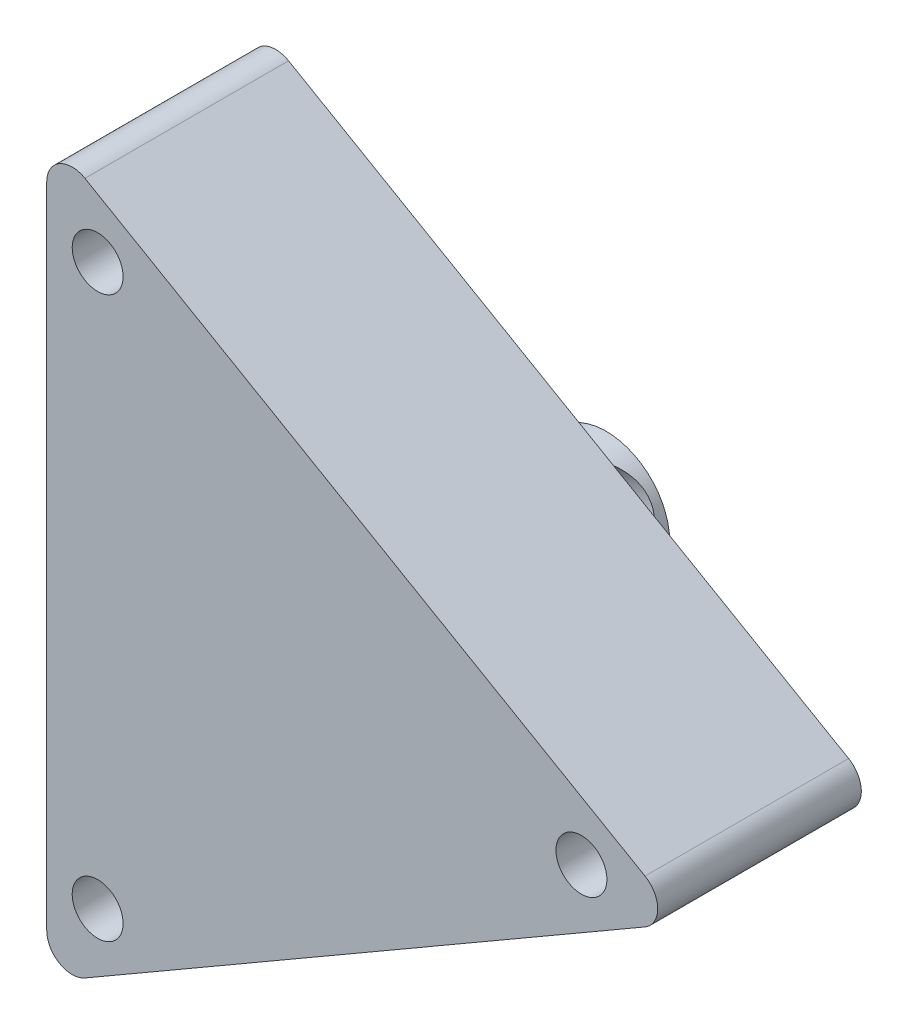
ISO-10303-21;
HEADER;
FILE_DESCRIPTION(('STEP AP214'),'2;1');
FILE_NAME('part.step','',(''),(''),'','','');
FILE_SCHEMA(('AUTOMOTIVE_DESIGN { 1 0 10303 214 1 1 1 1 }'));
ENDSEC;
DATA;
#1=APPLICATION_CONTEXT('core data for automotive mechanical design processes');
#2=APPLICATION_PROTOCOL_DEFINITION('international standard','automotive_design',2000,#1);
#3=PRODUCT_CONTEXT('',#1,'mechanical');
#4=PRODUCT('Part','Part','',(#3));
#5=PRODUCT_RELATED_PRODUCT_CATEGORY('part','',(#4));
#6=PRODUCT_DEFINITION_FORMATION('','',#4);
#7=PRODUCT_DEFINITION_CONTEXT('part definition',#1,'design');
#8=PRODUCT_DEFINITION('design','',#6,#7);
#9=PRODUCT_DEFINITION_SHAPE('','',#8);
#10=(LENGTH_UNIT() NAMED_UNIT(*) SI_UNIT(.MILLI.,.METRE.));
#11=(NAMED_UNIT(*) PLANE_ANGLE_UNIT() SI_UNIT($,.RADIAN.));
#12=(NAMED_UNIT(*) SI_UNIT($,.STERADIAN.) SOLID_ANGLE_UNIT());
#13=UNCERTAINTY_MEASURE_WITH_UNIT(LENGTH_MEASURE(1.E-05),#10,'distance_accuracy_value','');
#14=(GEOMETRIC_REPRESENTATION_CONTEXT(3) GLOBAL_UNCERTAINTY_ASSIGNED_CONTEXT((#13)) GLOBAL_UNIT_ASSIGNED_CONTEXT((#10,
#11,#12)) REPRESENTATION_CONTEXT('',''));
#15=CARTESIAN_POINT('',(0.,0.,0.));
#16=DIRECTION('',(0.,0.,1.));
#17=DIRECTION('',(1.,0.,0.));
#18=AXIS2_PLACEMENT_3D('',#15,#16,#17);
#19=CARTESIAN_POINT('',(-25.1468144044321,25.478473852621,16.));
#20=DIRECTION('',(0.,0.,-1.));
#21=DIRECTION('',(-1.,0.,0.));
#22=AXIS2_PLACEMENT_3D('',#19,#20,#21);
#23=CYLINDRICAL_SURFACE('',#22,2.);
#24=CARTESIAN_POINT('',(-25.1468144044321,25.478473852621,0.));
#25=DIRECTION('',(0.,0.,-1.));
#26=DIRECTION('',(-1.,0.,0.));
#27=AXIS2_PLACEMENT_3D('',#24,#25,#26);
#28=CIRCLE('',#27,2.);
#29=CARTESIAN_POINT('',(-27.1468144044321,25.478473852621,0.));
#30=VERTEX_POINT('',#29);
#31=CARTESIAN_POINT('',(-24.1447418633488,27.2093264235833,0.));
#32=VERTEX_POINT('',#31);
#33=EDGE_CURVE('E125',#30,#32,#28,.T.);
#34=ORIENTED_EDGE('',*,*,#33,.F.);
#35=DIRECTION('',(0.,0.,-1.));
#36=VECTOR('',#35,1.);
#37=CARTESIAN_POINT('',(-27.1468144044321,25.478473852621,16.));
#38=LINE('',#37,#36);
#39=CARTESIAN_POINT('',(-27.1468144044321,25.478473852621,16.));
#40=VERTEX_POINT('',#39);
#41=EDGE_CURVE('E54',#40,#30,#38,.T.);
#42=ORIENTED_EDGE('',*,*,#41,.F.);
#43=CARTESIAN_POINT('',(-25.1468144044321,25.478473852621,16.));
#44=DIRECTION('',(0.,0.,-1.));
#45=DIRECTION('',(-1.,0.,0.));
#46=AXIS2_PLACEMENT_3D('',#43,#44,#45);
#47=CIRCLE('',#46,2.);
#48=CARTESIAN_POINT('',(-24.1447418633488,27.2093264235833,16.));
#49=VERTEX_POINT('',#48);
#50=EDGE_CURVE('E141',#40,#49,#47,.T.);
#51=ORIENTED_EDGE('',*,*,#50,.T.);
#52=DIRECTION('',(0.,0.,-1.));
#53=VECTOR('',#52,1.);
#54=CARTESIAN_POINT('',(-24.1447418633488,27.2093264235833,16.));
#55=LINE('',#54,#53);
#56=EDGE_CURVE('E89',#49,#32,#55,.T.);
#57=ORIENTED_EDGE('',*,*,#56,.T.);
#58=EDGE_LOOP('',(#34,#42,#51,#57));
#59=FACE_BOUND('',#58,.T.);
#60=ADVANCED_FACE('F33',(#59),#23,.T.);
#61=CARTESIAN_POINT('',(-27.1468144044321,-25.478473852621,16.));
#62=DIRECTION('',(-1.,0.,0.));
#63=DIRECTION('',(0.,0.,1.));
#64=AXIS2_PLACEMENT_3D('',#61,#62,#63);
#65=PLANE('',#64);
#66=DIRECTION('',(0.,1.,0.));
#67=VECTOR('',#66,1.);
#68=CARTESIAN_POINT('',(-27.1468144044321,-25.478473852621,0.));
#69=LINE('',#68,#67);
#70=CARTESIAN_POINT('',(-27.1468144044321,-25.478473852621,0.));
#71=VERTEX_POINT('',#70);
#72=EDGE_CURVE('E138',#71,#30,#69,.T.);
#73=ORIENTED_EDGE('',*,*,#72,.F.);
#74=DIRECTION('',(0.,0.,-1.));
#75=VECTOR('',#74,1.);
#76=CARTESIAN_POINT('',(-27.1468144044321,-25.478473852621,16.));
#77=LINE('',#76,#75);
#78=CARTESIAN_POINT('',(-27.1468144044321,-25.478473852621,16.));
#79=VERTEX_POINT('',#78);
#80=EDGE_CURVE('E77',#79,#71,#77,.T.);
#81=ORIENTED_EDGE('',*,*,#80,.F.);
#82=DIRECTION('',(0.,1.,0.));
#83=VECTOR('',#82,1.);
#84=CARTESIAN_POINT('',(-27.1468144044321,-25.478473852621,16.));
#85=LINE('',#84,#83);
#86=EDGE_CURVE('E115',#79,#40,#85,.T.);
#87=ORIENTED_EDGE('',*,*,#86,.T.);
#88=ORIENTED_EDGE('',*,*,#41,.T.);
#89=EDGE_LOOP('',(#73,#81,#87,#88));
#90=FACE_BOUND('',#89,.T.);
#91=ADVANCED_FACE('F186',(#90),#65,.T.);
#92=CARTESIAN_POINT('',(-25.1468144044321,-25.478473852621,16.));
#93=DIRECTION('',(0.,0.,-1.));
#94=DIRECTION('',(-1.,0.,0.));
#95=AXIS2_PLACEMENT_3D('',#92,#93,#94);
#96=CYLINDRICAL_SURFACE('',#95,2.);
#97=CARTESIAN_POINT('',(-25.1468144044321,-25.478473852621,0.));
#98=DIRECTION('',(0.,0.,-1.));
#99=DIRECTION('',(-1.,0.,0.));
#100=AXIS2_PLACEMENT_3D('',#97,#98,#99);
#101=CIRCLE('',#100,2.);
#102=CARTESIAN_POINT('',(-24.1447418633487,-27.2093264235833,0.));
#103=VERTEX_POINT('',#102);
#104=EDGE_CURVE('E102',#103,#71,#101,.T.);
#105=ORIENTED_EDGE('',*,*,#104,.F.);
#106=DIRECTION('',(0.,0.,-1.));
#107=VECTOR('',#106,1.);
#108=CARTESIAN_POINT('',(-24.1447418633487,-27.2093264235833,16.));
#109=LINE('',#108,#107);
#110=CARTESIAN_POINT('',(-24.1447418633487,-27.2093264235833,16.));
#111=VERTEX_POINT('',#110);
#112=EDGE_CURVE('E97',#111,#103,#109,.T.);
#113=ORIENTED_EDGE('',*,*,#112,.F.);
#114=CARTESIAN_POINT('',(-25.1468144044321,-25.478473852621,16.));
#115=DIRECTION('',(0.,0.,-1.));
#116=DIRECTION('',(-1.,0.,0.));
#117=AXIS2_PLACEMENT_3D('',#114,#115,#116);
#118=CIRCLE('',#117,2.);
#119=EDGE_CURVE('E100',#111,#79,#118,.T.);
#120=ORIENTED_EDGE('',*,*,#119,.T.);
#121=ORIENTED_EDGE('',*,*,#80,.T.);
#122=EDGE_LOOP('',(#105,#113,#120,#121));
#123=FACE_BOUND('',#122,.T.);
#124=ADVANCED_FACE('F99',(#123),#96,.T.);
#125=CARTESIAN_POINT('',(19.8635311548149,-1.73085257096226,16.));
#126=DIRECTION('',(0.501036270541704,-0.865426285481126,0.));
#127=DIRECTION('',(0.865426285481126,0.501036270541704,0.));
#128=AXIS2_PLACEMENT_3D('',#125,#126,#127);
#129=PLANE('',#128);
#130=DIRECTION('',(-0.865426285481126,-0.501036270541704,0.));
#131=VECTOR('',#130,1.);
#132=CARTESIAN_POINT('',(19.8635311548149,-1.73085257096226,0.));
#133=LINE('',#132,#131);
#134=CARTESIAN_POINT('',(19.8635311548149,-1.73085257096226,0.));
#135=VERTEX_POINT('',#134);
#136=EDGE_CURVE('E135',#135,#103,#133,.T.);
#137=ORIENTED_EDGE('',*,*,#136,.F.);
#138=DIRECTION('',(0.,0.,-1.));
#139=VECTOR('',#138,1.);
#140=CARTESIAN_POINT('',(19.8635311548149,-1.73085257096226,16.));
#141=LINE('',#140,#139);
#142=CARTESIAN_POINT('',(19.8635311548149,-1.73085257096226,16.));
#143=VERTEX_POINT('',#142);
#144=EDGE_CURVE('E107',#143,#135,#141,.T.);
#145=ORIENTED_EDGE('',*,*,#144,.F.);
#146=DIRECTION('',(-0.865426285481126,-0.501036270541704,0.));
#147=VECTOR('',#146,1.);
#148=CARTESIAN_POINT('',(19.8635311548149,-1.73085257096226,16.));
#149=LINE('',#148,#147);
#150=EDGE_CURVE('E113',#143,#111,#149,.T.);
#151=ORIENTED_EDGE('',*,*,#150,.T.);
#152=ORIENTED_EDGE('',*,*,#112,.T.);
#153=EDGE_LOOP('',(#137,#145,#151,#152));
#154=FACE_BOUND('',#153,.T.);
#155=ADVANCED_FACE('F117',(#154),#129,.T.);
#156=CARTESIAN_POINT('',(18.8614586137315,0.,16.));
#157=DIRECTION('',(0.,0.,-1.));
#158=DIRECTION('',(-1.,0.,0.));
#159=AXIS2_PLACEMENT_3D('',#156,#157,#158);
#160=CYLINDRICAL_SURFACE('',#159,2.00000000000002);
#161=CARTESIAN_POINT('',(18.8614586137315,0.,0.));
#162=DIRECTION('',(0.,0.,-1.));
#163=DIRECTION('',(-1.,0.,0.));
#164=AXIS2_PLACEMENT_3D('',#161,#162,#163);
#165=CIRCLE('',#164,2.00000000000002);
#166=CARTESIAN_POINT('',(19.8635311548149,1.73085257096225,0.));
#167=VERTEX_POINT('',#166);
#168=EDGE_CURVE('E132',#167,#135,#165,.T.);
#169=ORIENTED_EDGE('',*,*,#168,.F.);
#170=DIRECTION('',(0.,0.,-1.));
#171=VECTOR('',#170,1.);
#172=CARTESIAN_POINT('',(19.8635311548149,1.73085257096225,16.));
#173=LINE('',#172,#171);
#174=CARTESIAN_POINT('',(19.8635311548149,1.73085257096225,16.));
#175=VERTEX_POINT('',#174);
#176=EDGE_CURVE('E145',#175,#167,#173,.T.);
#177=ORIENTED_EDGE('',*,*,#176,.F.);
#178=CARTESIAN_POINT('',(18.8614586137315,0.,16.));
#179=DIRECTION('',(0.,0.,-1.));
#180=DIRECTION('',(-1.,0.,0.));
#181=AXIS2_PLACEMENT_3D('',#178,#179,#180);
#182=CIRCLE('',#181,2.00000000000002);
#183=EDGE_CURVE('E118',#175,#143,#182,.T.);
#184=ORIENTED_EDGE('',*,*,#183,.T.);
#185=ORIENTED_EDGE('',*,*,#144,.T.);
#186=EDGE_LOOP('',(#169,#177,#184,#185));
#187=FACE_BOUND('',#186,.T.);
#188=ADVANCED_FACE('F194',(#187),#160,.T.);
#189=CARTESIAN_POINT('',(-24.1447418633488,27.2093264235833,16.));
#190=DIRECTION('',(0.501036270541704,0.865426285481126,0.));
#191=DIRECTION('',(-0.865426285481126,0.501036270541704,0.));
#192=AXIS2_PLACEMENT_3D('',#189,#190,#191);
#193=PLANE('',#192);
#194=DIRECTION('',(0.865426285481126,-0.501036270541704,0.));
#195=VECTOR('',#194,1.);
#196=CARTESIAN_POINT('',(-24.1447418633488,27.2093264235833,0.));
#197=LINE('',#196,#195);
#198=EDGE_CURVE('E128',#32,#167,#197,.T.);
#199=ORIENTED_EDGE('',*,*,#198,.F.);
#200=ORIENTED_EDGE('',*,*,#56,.F.);
#201=DIRECTION('',(0.865426285481126,-0.501036270541704,0.));
#202=VECTOR('',#201,1.);
#203=CARTESIAN_POINT('',(-24.1447418633488,27.2093264235833,16.));
#204=LINE('',#203,#202);
#205=EDGE_CURVE('E120',#49,#175,#204,.T.);
#206=ORIENTED_EDGE('',*,*,#205,.T.);
#207=ORIENTED_EDGE('',*,*,#176,.T.);
#208=EDGE_LOOP('',(#199,#200,#206,#207));
#209=FACE_BOUND('',#208,.T.);
#210=ADVANCED_FACE('F195',(#209),#193,.T.);
#211=CARTESIAN_POINT('',(-25.1468144044321,25.478473852621,16.));
#212=DIRECTION('',(0.,0.,-1.));
#213=DIRECTION('',(-1.,0.,0.));
#214=AXIS2_PLACEMENT_3D('',#211,#212,#213);
#215=PLANE('',#214);
#216=CARTESIAN_POINT('',(-23.1468144044321,-22.0095792841894,16.));
#217=DIRECTION('',(0.,0.,-1.));
#218=DIRECTION('',(-1.,0.,0.));
#219=AXIS2_PLACEMENT_3D('',#216,#217,#218);
#220=CIRCLE('',#219,2.);
#221=CARTESIAN_POINT('',(-25.1468144044321,-22.0095792841894,16.));
#222=VERTEX_POINT('',#221);
#223=EDGE_CURVE('E212',#222,#222,#220,.T.);
#224=ORIENTED_EDGE('',*,*,#223,.T.);
#225=EDGE_LOOP('',(#224));
#226=FACE_BOUND('',#225,.T.);
#227=CARTESIAN_POINT('',(14.8697316318951,0.,16.));
#228=DIRECTION('',(0.,0.,-1.));
#229=DIRECTION('',(-1.,0.,0.));
#230=AXIS2_PLACEMENT_3D('',#227,#228,#229);
#231=CIRCLE('',#230,2.);
#232=CARTESIAN_POINT('',(12.8697316318951,0.,16.));
#233=VERTEX_POINT('',#232);
#234=EDGE_CURVE('E206',#233,#233,#231,.T.);
#235=ORIENTED_EDGE('',*,*,#234,.T.);
#236=EDGE_LOOP('',(#235));
#237=FACE_BOUND('',#236,.T.);
#238=CARTESIAN_POINT('',(-23.1468144044321,22.0095792841894,16.));
#239=DIRECTION('',(0.,0.,-1.));
#240=DIRECTION('',(-1.,0.,0.));
#241=AXIS2_PLACEMENT_3D('',#238,#239,#240);
#242=CIRCLE('',#241,2.);
#243=CARTESIAN_POINT('',(-25.1468144044321,22.0095792841894,16.));
#244=VERTEX_POINT('',#243);
#245=EDGE_CURVE('E200',#244,#244,#242,.T.);
#246=ORIENTED_EDGE('',*,*,#245,.T.);
#247=EDGE_LOOP('',(#246));
#248=FACE_BOUND('',#247,.T.);
#249=ORIENTED_EDGE('',*,*,#50,.F.);
#250=ORIENTED_EDGE('',*,*,#86,.F.);
#251=ORIENTED_EDGE('',*,*,#119,.F.);
#252=ORIENTED_EDGE('',*,*,#150,.F.);
#253=ORIENTED_EDGE('',*,*,#183,.F.);
#254=ORIENTED_EDGE('',*,*,#205,.F.);
#255=EDGE_LOOP('',(#249,#250,#251,#252,#253,#254));
#256=FACE_BOUND('',#255,.T.);
#257=ADVANCED_FACE('F111',(#226,#237,#248,#256),#215,.F.);
#258=CARTESIAN_POINT('',(-25.1468144044321,25.478473852621,0.));
#259=DIRECTION('',(0.,0.,-1.));
#260=DIRECTION('',(-1.,0.,0.));
#261=AXIS2_PLACEMENT_3D('',#258,#259,#260);
#262=PLANE('',#261);
#263=CARTESIAN_POINT('',(-23.1468144044321,-22.0095792841894,0.));
#264=DIRECTION('',(0.,0.,-1.));
#265=DIRECTION('',(-1.,0.,0.));
#266=AXIS2_PLACEMENT_3D('',#263,#264,#265);
#267=CIRCLE('',#266,1.99999999999999);
#268=CARTESIAN_POINT('',(-25.1468144044321,-22.0095792841894,0.));
#269=VERTEX_POINT('',#268);
#270=EDGE_CURVE('E154',#269,#269,#267,.T.);
#271=ORIENTED_EDGE('',*,*,#270,.F.);
#272=EDGE_LOOP('',(#271));
#273=FACE_BOUND('',#272,.T.);
#274=CARTESIAN_POINT('',(14.8697316318951,0.,0.));
#275=DIRECTION('',(0.,0.,-1.));
#276=DIRECTION('',(-1.,0.,0.));
#277=AXIS2_PLACEMENT_3D('',#274,#275,#276);
#278=CIRCLE('',#277,1.99999999999999);
#279=CARTESIAN_POINT('',(12.8697316318951,0.,0.));
#280=VERTEX_POINT('',#279);
#281=EDGE_CURVE('E209',#280,#280,#278,.T.);
#282=ORIENTED_EDGE('',*,*,#281,.F.);
#283=EDGE_LOOP('',(#282));
#284=FACE_BOUND('',#283,.T.);
#285=CARTESIAN_POINT('',(-23.1468144044321,22.0095792841894,0.));
#286=DIRECTION('',(0.,0.,-1.));
#287=DIRECTION('',(-1.,0.,0.));
#288=AXIS2_PLACEMENT_3D('',#285,#286,#287);
#289=CIRCLE('',#288,1.99999999999999);
#290=CARTESIAN_POINT('',(-25.1468144044321,22.0095792841894,0.));
#291=VERTEX_POINT('',#290);
#292=EDGE_CURVE('E203',#291,#291,#289,.T.);
#293=ORIENTED_EDGE('',*,*,#292,.F.);
#294=EDGE_LOOP('',(#293));
#295=FACE_BOUND('',#294,.T.);
#296=CARTESIAN_POINT('',(-9.19345641604796,-0.521526147378951,0.));
#297=DIRECTION('',(0.,0.,-1.));
#298=DIRECTION('',(-1.,0.,0.));
#299=AXIS2_PLACEMENT_3D('',#296,#297,#298);
#300=CIRCLE('',#299,5.);
#301=CARTESIAN_POINT('',(-14.193456416048,-0.521526147378951,0.));
#302=VERTEX_POINT('',#301);
#303=EDGE_CURVE('E46',#302,#302,#300,.T.);
#304=ORIENTED_EDGE('',*,*,#303,.F.);
#305=EDGE_LOOP('',(#304));
#306=FACE_BOUND('',#305,.T.);
#307=ORIENTED_EDGE('',*,*,#33,.T.);
#308=ORIENTED_EDGE('',*,*,#198,.T.);
#309=ORIENTED_EDGE('',*,*,#168,.T.);
#310=ORIENTED_EDGE('',*,*,#136,.T.);
#311=ORIENTED_EDGE('',*,*,#104,.T.);
#312=ORIENTED_EDGE('',*,*,#72,.T.);
#313=EDGE_LOOP('',(#307,#308,#309,#310,#311,#312));
#314=FACE_BOUND('',#313,.T.);
#315=ADVANCED_FACE('F182',(#273,#284,#295,#306,#314),#262,.T.);
#316=CARTESIAN_POINT('',(-9.19345641604796,-0.521526147378951,-10.));
#317=DIRECTION('',(0.,0.,1.));
#318=DIRECTION('',(1.,0.,0.));
#319=AXIS2_PLACEMENT_3D('',#316,#317,#318);
#320=CYLINDRICAL_SURFACE('',#319,5.);
#321=CARTESIAN_POINT('',(-4.19345641604796,-0.521526147378951,-8.24439691200529));
#322=CARTESIAN_POINT('',(-4.19345916948969,-0.342298688618187,-8.37748777826181));
#323=CARTESIAN_POINT('',(-4.20310612124389,-0.155619780136836,-8.50096649204125));
#324=CARTESIAN_POINT('',(-4.24632829181436,0.229045207141141,-8.72518604979591));
#325=CARTESIAN_POINT('',(-4.27994389870893,0.427049851543049,-8.82588813652684));
#326=CARTESIAN_POINT('',(-4.35122506777449,0.728941359575421,-8.95661594795724));
#327=CARTESIAN_POINT('',(-4.37864610461334,0.830891881994033,-8.99694950673632));
#328=CARTESIAN_POINT('',(-4.44079784296238,1.03527206923635,-9.07000057207638));
#329=CARTESIAN_POINT('',(-4.47552482894011,1.13770146473137,-9.10272193217251));
#330=CARTESIAN_POINT('',(-4.55239442651627,1.34192125272572,-9.15997411349922));
#331=CARTESIAN_POINT('',(-4.59452793216567,1.44371227272609,-9.18451488626856));
#332=CARTESIAN_POINT('',(-4.68617638251891,1.64566406957404,-9.22501813173706));
#333=CARTESIAN_POINT('',(-4.73569006652046,1.74582512162223,-9.24098206741463));
#334=CARTESIAN_POINT('',(-4.83498510334159,1.9306733059116,-9.2625762163748));
#335=CARTESIAN_POINT('',(-4.88391538957641,2.01569567228155,-9.2692702753087));
#336=CARTESIAN_POINT('',(-4.98684631247058,2.18292828492754,-9.27588310647082));
#337=CARTESIAN_POINT('',(-5.04084857080928,2.26513762024223,-9.27579970430108));
#338=CARTESIAN_POINT('',(-5.15344800776654,2.42600915089038,-9.268917886719));
#339=CARTESIAN_POINT('',(-5.21204347379046,2.50467265123306,-9.26212196323461));
#340=CARTESIAN_POINT('',(-5.3333205988804,2.65792675772495,-9.24201377379702));
#341=CARTESIAN_POINT('',(-5.3960038014871,2.73251580558376,-9.22869903382567));
#342=CARTESIAN_POINT('',(-5.58146999243399,2.94063261137564,-9.18138322078025));
#343=CARTESIAN_POINT('',(-5.70874479866053,3.06847492453963,-9.13948121241655));
#344=CARTESIAN_POINT('',(-5.97167208286803,3.30621584067539,-9.03621875670646));
#345=CARTESIAN_POINT('',(-6.10732642731309,3.41611042595031,-8.97485396152918));
#346=CARTESIAN_POINT('',(-6.34151761745476,3.58707928583913,-8.8567053940061));
#347=CARTESIAN_POINT('',(-6.43883878010231,3.65285364871781,-8.80417319297005));
#348=CARTESIAN_POINT('',(-6.63480893530425,3.77576530877309,-8.69195714138192));
#349=CARTESIAN_POINT('',(-6.73345830617683,3.83290008589539,-8.63227121324675));
#350=CARTESIAN_POINT('',(-7.03046699028691,3.99200067949139,-8.44343233985307));
#351=CARTESIAN_POINT('',(-7.22957847899683,4.08144345110171,-8.30465610445921));
#352=CARTESIAN_POINT('',(-7.55409669581312,4.20406533571621,-8.05910669924689));
#353=CARTESIAN_POINT('',(-7.68086617705598,4.24597582841089,-7.95817492923926));
#354=CARTESIAN_POINT('',(-7.93117693013981,4.31826587786325,-7.74844396995811));
#355=CARTESIAN_POINT('',(-8.05471841407397,4.34864619398565,-7.63964529935203));
#356=CARTESIAN_POINT('',(-8.29689819871609,4.39898939830889,-7.41464292793171));
#357=CARTESIAN_POINT('',(-8.41553962681421,4.41895902862886,-7.29844407444876));
#358=CARTESIAN_POINT('',(-8.64600521865315,4.44976953256255,-7.05844426658286));
#359=CARTESIAN_POINT('',(-8.75783375689692,4.46061632242413,-6.93464829498822));
#360=CARTESIAN_POINT('',(-8.968389233432,4.47448259568648,-6.68267048676366));
#361=CARTESIAN_POINT('',(-9.06742275414754,4.47774367004735,-6.55475961692537));
#362=CARTESIAN_POINT('',(-9.25208186150349,4.47897684321315,-6.28944110645972));
#363=CARTESIAN_POINT('',(-9.33771710627436,4.47695277060148,-6.15204041051092));
#364=CARTESIAN_POINT('',(-9.4707417879145,4.47111962476802,-5.89838672022591));
#365=CARTESIAN_POINT('',(-9.52240036824937,4.46781985699927,-5.78441044991306));
#366=CARTESIAN_POINT('',(-9.60721953546976,4.46150900925753,-5.54980644637484));
#367=CARTESIAN_POINT('',(-9.64043702115168,4.45849706530388,-5.42920044882617));
#368=CARTESIAN_POINT('',(-9.67886083491971,4.45488893431215,-5.20470190075112));
#369=CARTESIAN_POINT('',(-9.68789510164501,4.45396694763574,-5.10149181082568));
#370=CARTESIAN_POINT('',(-9.68769763913739,4.45398633687926,-4.89511594388491));
#371=CARTESIAN_POINT('',(-9.67847039187442,4.45492725558159,-4.79195016221063));
#372=CARTESIAN_POINT('',(-9.63904713071716,4.45862558740671,-4.56404581482623));
#373=CARTESIAN_POINT('',(-9.60432024091537,4.4617672258433,-4.44012297401406));
#374=CARTESIAN_POINT('',(-9.5156398830113,4.46827635138145,-4.19920866251741));
#375=CARTESIAN_POINT('',(-9.46160964409871,4.4716446960603,-4.0822470758083));
#376=CARTESIAN_POINT('',(-9.34505065761372,4.47649067474157,-3.86415617084411));
#377=CARTESIAN_POINT('',(-9.28348563923024,4.47809302180629,-3.76249985461086));
#378=CARTESIAN_POINT('',(-9.15228923270165,4.478735308153,-3.56446239472292));
#379=CARTESIAN_POINT('',(-9.08265066621617,4.477772950135,-3.4680860594389));
#380=CARTESIAN_POINT('',(-8.9373182150258,4.47244009691321,-3.27980201454654));
#381=CARTESIAN_POINT('',(-8.86161103239445,4.46806192285576,-3.18790486945735));
#382=CARTESIAN_POINT('',(-8.70568692091955,4.45524075662892,-3.00830210007943));
#383=CARTESIAN_POINT('',(-8.6254689057061,4.44679678153401,-2.92059749499504));
#384=CARTESIAN_POINT('',(-8.4290925121549,4.42104914850376,-2.71514609687432));
#385=CARTESIAN_POINT('',(-8.31127470250486,4.40156172030637,-2.59924677244954));
#386=CARTESIAN_POINT('',(-8.07077918340303,4.35235187490038,-2.37480737597062));
#387=CARTESIAN_POINT('',(-7.94809947983742,4.32262521879219,-2.26627037412604));
#388=CARTESIAN_POINT('',(-7.69971352021631,4.25187582451884,-2.05715425586006));
#389=CARTESIAN_POINT('',(-7.57401474578958,4.21087881527131,-1.95655767766493));
#390=CARTESIAN_POINT('',(-7.32078217630338,4.11650785894994,-1.76385189817089));
#391=CARTESIAN_POINT('',(-7.19324852614705,4.06313488424868,-1.67174203087));
#392=CARTESIAN_POINT('',(-6.88642715337643,3.91882861103084,-1.46203112375955));
#393=CARTESIAN_POINT('',(-6.70692304171684,3.8214191214553,-1.34904767632007));
#394=CARTESIAN_POINT('',(-6.35239330998994,3.59819459694785,-1.14662698978295));
#395=CARTESIAN_POINT('',(-6.17736196099414,3.47241815961935,-1.05715811037133));
#396=CARTESIAN_POINT('',(-5.86498101665691,3.21418950875447,-0.919043138031569));
#397=CARTESIAN_POINT('',(-5.72604845255924,3.08593528221401,-0.866179645895534));
#398=CARTESIAN_POINT('',(-5.46051014957023,2.81038552539226,-0.78429901589669));
#399=CARTESIAN_POINT('',(-5.33389729953392,2.6631010953411,-0.755268048658818));
#400=CARTESIAN_POINT('',(-5.09713667224774,2.35222856954133,-0.72340815325369));
#401=CARTESIAN_POINT('',(-4.98705613504464,2.18857817512174,-0.720683520408072));
#402=CARTESIAN_POINT('',(-4.7876976431998,1.8507623163547,-0.742454141656469));
#403=CARTESIAN_POINT('',(-4.69841970442091,1.67659684398919,-0.766949416506723));
#404=CARTESIAN_POINT('',(-4.54747084405122,1.33520651161828,-0.839472118324363));
#405=CARTESIAN_POINT('',(-4.48440067971795,1.16824901225673,-0.885896323562519));
#406=CARTESIAN_POINT('',(-4.37784721437792,0.8351323184974,-0.999275577062459));
#407=CARTESIAN_POINT('',(-4.33436887103068,0.668973336674149,-1.06623581471801));
#408=CARTESIAN_POINT('',(-4.2624509051691,0.32618852633245,-1.22507403355432));
#409=CARTESIAN_POINT('',(-4.2357598708929,0.150003523526616,-1.31867606763386));
#410=CARTESIAN_POINT('',(-4.20125632061864,-0.193277399610368,-1.52410254139069));
#411=CARTESIAN_POINT('',(-4.19345324274024,-0.360368735182708,-1.63593606137885));
#412=CARTESIAN_POINT('',(-4.19346025056706,-0.716355843633199,-1.90027338685779));
#413=CARTESIAN_POINT('',(-4.20485759326618,-0.902552518678343,-2.05639758499797));
#414=CARTESIAN_POINT('',(-4.24424629111269,-1.25403162724968,-2.38922777193836));
#415=CARTESIAN_POINT('',(-4.27226063357317,-1.41928470313636,-2.56596199923765));
#416=CARTESIAN_POINT('',(-4.32032696758902,-1.64314358542982,-2.84048405192841));
#417=CARTESIAN_POINT('',(-4.33677230704489,-1.71198665362109,-2.93068080395455));
#418=CARTESIAN_POINT('',(-4.37079387985451,-1.8430864468458,-3.11552833874277));
#419=CARTESIAN_POINT('',(-4.38837027443247,-1.90534222954727,-3.21017975596818));
#420=CARTESIAN_POINT('',(-4.44121127025655,-2.0806672337197,-3.50064599684138));
#421=CARTESIAN_POINT('',(-4.4766888076912,-2.18272124515997,-3.70348295623167));
#422=CARTESIAN_POINT('',(-4.52793951640876,-2.32059074276092,-4.06038400086152));
#423=CARTESIAN_POINT('',(-4.54640576119101,-2.36713949394884,-4.2098832824666));
#424=CARTESIAN_POINT('',(-4.57458464326885,-2.43658845679643,-4.51497065945053));
#425=CARTESIAN_POINT('',(-4.5843176452402,-2.45954370343625,-4.6705437022319));
#426=CARTESIAN_POINT('',(-4.59252680458992,-2.47897272666947,-4.98459681837022));
#427=CARTESIAN_POINT('',(-4.59093919099203,-2.47529648163447,-5.14308833590229));
#428=CARTESIAN_POINT('',(-4.5768098483855,-2.44164517907364,-5.45681653427495));
#429=CARTESIAN_POINT('',(-4.56425258435019,-2.41163282453927,-5.61204827928701));
#430=CARTESIAN_POINT('',(-4.52686804465685,-2.31765963977672,-5.95688195437207));
#431=CARTESIAN_POINT('',(-4.49962123553207,-2.24664916216496,-6.14424431868551));
#432=CARTESIAN_POINT('',(-4.44056232722577,-2.07654120062304,-6.50533232573332));
#433=CARTESIAN_POINT('',(-4.40873303636534,-1.97733651300486,-6.67900262350817));
#434=CARTESIAN_POINT('',(-4.35589283525038,-1.78832143429787,-6.96542697079253));
#435=CARTESIAN_POINT('',(-4.33435510723519,-1.70370372458877,-7.08158595665227));
#436=CARTESIAN_POINT('',(-4.29429295477231,-1.52481618212313,-7.30688892206865));
#437=CARTESIAN_POINT('',(-4.27577019326994,-1.43054106908704,-7.41602901031944));
#438=CARTESIAN_POINT('',(-4.24346685929448,-1.23392256620989,-7.62682201046454));
#439=CARTESIAN_POINT('',(-4.22967070830221,-1.13160707487965,-7.72849863332788));
#440=CARTESIAN_POINT('',(-4.20818778670288,-0.919571108038158,-7.9245004580163));
#441=CARTESIAN_POINT('',(-4.20049883052919,-0.809853296840965,-8.0188282788296));
#442=CARTESIAN_POINT('',(-4.19450972942802,-0.639275628529022,-8.15530140393614));
#443=CARTESIAN_POINT('',(-4.19345550530293,-0.580808505268483,-8.20037497239961));
#444=CARTESIAN_POINT('',(-4.19345641604796,-0.521526147378951,-8.24439691200529));
#445=B_SPLINE_CURVE_WITH_KNOTS('',3,(#321,#322,#323,#324,#325,#326,#327,#328,#329,#330,#331,
#332,#333,#334,#335,#336,#337,#338,#339,#340,#341,#342,#343,#344,#345,#346,#347,#348,#349,#350,
#351,#352,#353,#354,#355,#356,#357,#358,#359,#360,#361,#362,#363,#364,#365,#366,#367,#368,#369,
#370,#371,#372,#373,#374,#375,#376,#377,#378,#379,#380,#381,#382,#383,#384,#385,#386,#387,#388,
#389,#390,#391,#392,#393,#394,#395,#396,#397,#398,#399,#400,#401,#402,#403,#404,#405,#406,#407,
#408,#409,#410,#411,#412,#413,#414,#415,#416,#417,#418,#419,#420,#421,#422,#423,#424,#425,#426,
#427,#428,#429,#430,#431,#432,#433,#434,#435,#436,#437,#438,#439,#440,#441,#442,#443,#444),
.UNSPECIFIED.,.T.,.F.,(4,2,2,2,2,2,2,2,2,2,2,2,2,2,2,2,2,2,2,2,2,2,2,2,2,2,2,2,2,2,2,2,2,2,2,2,
2,2,2,2,2,2,2,2,2,2,2,2,2,2,2,2,2,2,2,2,2,2,2,2,2,4),(0.,0.669537363324396,1.3402055964179,
1.67883676320068,2.01729612934697,2.355342250247,2.69333069122252,2.98791132725956,
3.28258647332839,3.57715226654559,3.87182993999434,4.4249649088744,4.97822353081758,
5.3637467354258,5.74938217609613,6.5218678579752,7.0234816235489,7.5250623476578,
8.02631783563938,8.52724800352352,9.01199213050568,9.49638520417324,9.8708547530115,
10.2441623862282,10.5534247064204,10.8626111329857,11.2465610818102,11.6320553436201,
11.9881192276456,12.3445021582674,12.7016885646577,13.0589613658426,13.5576297700585,
14.0565048647533,14.5542504094301,15.0519568597654,15.7495333117932,16.4461662693719,
17.0326812360886,17.6188556228516,18.2073530342052,18.7958508943113,19.3467548246307,
19.8977980815838,20.4994661497664,21.1014348033544,21.8286808129466,22.556935220478,
22.9006435834408,23.2444010486827,23.9299138053701,24.4012211403494,24.8714265760467,
25.344282843965,25.8178098502279,26.4211095726851,27.0267346555836,27.4621898373965,
27.8978843924051,28.3321287989243,28.766217733371,28.987677959764),.UNSPECIFIED.);
#446=CARTESIAN_POINT('',(-4.19345641604796,-0.521526147378951,-8.24439691200529));
#447=VERTEX_POINT('',#446);
#448=EDGE_CURVE('E11',#447,#447,#445,.T.);
#449=ORIENTED_EDGE('',*,*,#448,.F.);
#450=EDGE_LOOP('',(#449));
#451=FACE_BOUND('',#450,.T.);
#452=CARTESIAN_POINT('',(-13.2621666832286,2.38460474467297,-5.));
#453=CARTESIAN_POINT('',(-13.2621663102974,2.38460510612077,-5.06142871755979));
#454=CARTESIAN_POINT('',(-13.2640438065572,2.38198226839878,-5.12285564326966));
#455=CARTESIAN_POINT('',(-13.2713968858627,2.37164498068755,-5.24507249176607));
#456=CARTESIAN_POINT('',(-13.27687429596,2.36392794524913,-5.30586207515982));
#457=CARTESIAN_POINT('',(-13.298185503259,2.33361321428511,-5.48679375214879));
#458=CARTESIAN_POINT('',(-13.3188953380342,2.30385467119877,-5.60520440386832));
#459=CARTESIAN_POINT('',(-13.3623223573804,2.23920549244925,-5.80537790052863));
#460=CARTESIAN_POINT('',(-13.3831474530051,2.20761278440429,-5.8887223378136));
#461=CARTESIAN_POINT('',(-13.4277755338711,2.137846118697,-6.05184140309126));
#462=CARTESIAN_POINT('',(-13.4515805626903,2.0996676377871,-6.13161352979838));
#463=CARTESIAN_POINT('',(-13.5009070234144,2.01779643195072,-6.28800953825681));
#464=CARTESIAN_POINT('',(-13.5264334529256,1.97408729743478,-6.36462311272808));
#465=CARTESIAN_POINT('',(-13.5781470430264,1.88207162166173,-6.51482035817998));
#466=CARTESIAN_POINT('',(-13.6043344295744,1.83376349208395,-6.58840296971784));
#467=CARTESIAN_POINT('',(-13.6779211192494,1.69209921954824,-6.7917865961516));
#468=CARTESIAN_POINT('',(-13.7251886194324,1.59415596149866,-6.91845543153807));
#469=CARTESIAN_POINT('',(-13.8161264055536,1.3873315386827,-7.16398252740431));
#470=CARTESIAN_POINT('',(-13.8597941114729,1.27844265098329,-7.28283517379206));
#471=CARTESIAN_POINT('',(-13.9412396667756,1.05108964552198,-7.51299561993985));
#472=CARTESIAN_POINT('',(-13.9790224293062,0.932633641879369,-7.62430966906302));
#473=CARTESIAN_POINT('',(-14.0468769831664,0.687007753776674,-7.83925774769118));
#474=CARTESIAN_POINT('',(-14.0769525301105,0.559842151807867,-7.94289550017297));
#475=CARTESIAN_POINT('',(-14.1422024166724,0.222694068206655,-8.19864076603831));
#476=CARTESIAN_POINT('',(-14.1705557617122,0.00672801199771354,-8.34480967278364));
#477=CARTESIAN_POINT('',(-14.1978500390756,-0.441669803932521,-8.61221771697683));
#478=CARTESIAN_POINT('',(-14.1968455025468,-0.674070236159809,-8.73350265333157));
#479=CARTESIAN_POINT('',(-14.1633913059409,-1.10065205080269,-8.9225493640686));
#480=CARTESIAN_POINT('',(-14.1375501599862,-1.2926833952447,-8.99619896953253));
#481=CARTESIAN_POINT('',(-14.0805421717881,-1.58272566881983,-9.08886128980316));
#482=CARTESIAN_POINT('',(-14.0584895533602,-1.67976698244606,-9.11678547970623));
#483=CARTESIAN_POINT('',(-14.0081484721351,-1.87384704130427,-9.1662253366183));
#484=CARTESIAN_POINT('',(-13.9798627492586,-1.97088576898651,-9.18774380968387));
#485=CARTESIAN_POINT('',(-13.9167775094239,-2.16491366295434,-9.22407541479731));
#486=CARTESIAN_POINT('',(-13.8819319128494,-2.26189728752781,-9.23883840940751));
#487=CARTESIAN_POINT('',(-13.8059897299057,-2.45419667713597,-9.26106815904009));
#488=CARTESIAN_POINT('',(-13.7648960525734,-2.54951319544735,-9.26853829758562));
#489=CARTESIAN_POINT('',(-13.6767243258516,-2.73762572100735,-9.27596387686455));
#490=CARTESIAN_POINT('',(-13.6296470936996,-2.83042207036546,-9.27592034272019));
#491=CARTESIAN_POINT('',(-13.529940223237,-3.01264922259763,-9.26824325199885));
#492=CARTESIAN_POINT('',(-13.4773110567494,-3.10208031058856,-9.2606103399303));
#493=CARTESIAN_POINT('',(-13.3730590599515,-3.26732313189932,-9.23907259440336));
#494=CARTESIAN_POINT('',(-13.3219473215765,-3.3435593620721,-9.22593866567412));
#495=CARTESIAN_POINT('',(-13.2162374992738,-3.49231305549065,-9.19386576123518));
#496=CARTESIAN_POINT('',(-13.1616383305002,-3.56482934879066,-9.1749249721366));
#497=CARTESIAN_POINT('',(-12.9933974280594,-3.77618030893452,-9.10971900680567));
#498=CARTESIAN_POINT('',(-12.875228439688,-3.90894870020984,-9.05505260220538));
#499=CARTESIAN_POINT('',(-12.6266470861827,-4.16100595881021,-8.92337455224734));
#500=CARTESIAN_POINT('',(-12.4959397711315,-4.27958843691647,-8.84559083707597));
#501=CARTESIAN_POINT('',(-12.2305952734042,-4.4971040234245,-8.67153148217745));
#502=CARTESIAN_POINT('',(-12.0959569721064,-4.59603147493513,-8.57525053441998));
#503=CARTESIAN_POINT('',(-11.8637243990101,-4.75040630051223,-8.39555579030536));
#504=CARTESIAN_POINT('',(-11.7661303562493,-4.81032773617035,-8.31589053103286));
#505=CARTESIAN_POINT('',(-11.5721628349399,-4.92086777446715,-8.14897769471598));
#506=CARTESIAN_POINT('',(-11.4757893665604,-4.97148629964659,-8.06173005454698));
#507=CARTESIAN_POINT('',(-11.285138694518,-5.06422917034315,-7.87985723972069));
#508=CARTESIAN_POINT('',(-11.1908717121715,-5.10631781847763,-7.78520326858932));
#509=CARTESIAN_POINT('',(-11.0061917627696,-5.18242277344873,-7.58922281598015));
#510=CARTESIAN_POINT('',(-10.9157771231821,-5.21644261334657,-7.4878992798027));
#511=CARTESIAN_POINT('',(-10.738801926795,-5.27766039903827,-7.27696475346102));
#512=CARTESIAN_POINT('',(-10.6523286929579,-5.3047375508755,-7.16724524815143));
#513=CARTESIAN_POINT('',(-10.4867209314885,-5.35214556732414,-6.94091367616166));
#514=CARTESIAN_POINT('',(-10.4075896312975,-5.37247347506419,-6.82429861479821));
#515=CARTESIAN_POINT('',(-10.25955851803,-5.40713504152796,-6.58465084941329));
#516=CARTESIAN_POINT('',(-10.190609777956,-5.42149800863708,-6.46165294654011));
#517=CARTESIAN_POINT('',(-10.0657663350665,-5.44525557641619,-6.20885219437211));
#518=CARTESIAN_POINT('',(-10.0098550347846,-5.45465651354715,-6.07905825762754));
#519=CARTESIAN_POINT('',(-9.91075751867515,-5.47008528469585,-5.80136706886945));
#520=CARTESIAN_POINT('',(-9.86911518359889,-5.47574546905554,-5.65287999731922));
#521=CARTESIAN_POINT('',(-9.81104948662451,-5.48332918567929,-5.35111840646643));
#522=CARTESIAN_POINT('',(-9.79457075748311,-5.48526092408871,-5.1978551571463));
#523=CARTESIAN_POINT('',(-9.78931091626327,-5.4858962062502,-4.89034681908679));
#524=CARTESIAN_POINT('',(-9.8006141279541,-5.48458992185044,-4.73610016200604));
#525=CARTESIAN_POINT('',(-9.84924855581428,-5.47838966668125,-4.43175983561026));
#526=CARTESIAN_POINT('',(-9.88662864752588,-5.47348895804379,-4.2816745159569));
#527=CARTESIAN_POINT('',(-10.0000507793969,-5.45647191111003,-3.93522413739192));
#528=CARTESIAN_POINT('',(-10.0852276362123,-5.4423737510066,-3.74197974459258));
#529=CARTESIAN_POINT('',(-10.2328179853117,-5.41256757459766,-3.46383992393789));
#530=CARTESIAN_POINT('',(-10.2854437457679,-5.401157587646,-3.37291166862035));
#531=CARTESIAN_POINT('',(-10.3961103208246,-5.37506590731625,-3.19489304288042));
#532=CARTESIAN_POINT('',(-10.4541499149675,-5.36038495029196,-3.10780181395175));
#533=CARTESIAN_POINT('',(-10.59781865206,-5.32103104667255,-2.90453899525683));
#534=CARTESIAN_POINT('',(-10.6854540071023,-5.29468826045726,-2.79010906906481));
#535=CARTESIAN_POINT('',(-10.8668995347347,-5.23414208009345,-2.56840635087459));
#536=CARTESIAN_POINT('',(-10.9607120420627,-5.1999357014833,-2.46113629625166));
#537=CARTESIAN_POINT('',(-11.1526520132922,-5.12285588356078,-2.25400632613276));
#538=CARTESIAN_POINT('',(-11.2507750373049,-5.07999120588396,-2.15413905804737));
#539=CARTESIAN_POINT('',(-11.449893889769,-4.98478533419382,-1.9620790583115));
#540=CARTESIAN_POINT('',(-11.5508900958886,-4.93244288946953,-1.86988734189363));
#541=CARTESIAN_POINT('',(-11.8155510657172,-4.78293344476329,-1.64079505312156));
#542=CARTESIAN_POINT('',(-11.9804064871697,-4.67773094056928,-1.51031656067321));
#543=CARTESIAN_POINT('',(-12.30732889178,-4.43875269496063,-1.27470795364903));
#544=CARTESIAN_POINT('',(-12.4693999742318,-4.30502370654564,-1.16953695484548));
#545=CARTESIAN_POINT('',(-12.7571710230095,-4.03325901559414,-1.00459461596921));
#546=CARTESIAN_POINT('',(-12.8844127458464,-3.89970564896524,-0.940167672266078));
#547=CARTESIAN_POINT('',(-13.1270919202812,-3.61370980811856,-0.835322841794354));
#548=CARTESIAN_POINT('',(-13.242535964371,-3.46127798960628,-0.794891484993945));
#549=CARTESIAN_POINT('',(-13.4572614252097,-3.1401869093104,-0.74010208775802));
#550=CARTESIAN_POINT('',(-13.5564810195781,-2.97146930232371,-0.725841754266626));
#551=CARTESIAN_POINT('',(-13.7344027856054,-2.62342887189308,-0.724231123405783));
#552=CARTESIAN_POINT('',(-13.8131048576061,-2.4441059969422,-0.736880956742212));
#553=CARTESIAN_POINT('',(-13.9440626159016,-2.09157422741927,-0.7861266702795));
#554=CARTESIAN_POINT('',(-13.9976055926729,-1.9186296345003,-0.821264341867622));
#555=CARTESIAN_POINT('',(-14.0848878719246,-1.57303782099598,-0.911723275781362));
#556=CARTESIAN_POINT('',(-14.1186207724774,-1.40039071449996,-0.96705105349167));
#557=CARTESIAN_POINT('',(-14.1595116178652,-1.11469575838394,-1.07418737732045));
#558=CARTESIAN_POINT('',(-14.1717450063995,-1.00053241494768,-1.12128433020858));
#559=CARTESIAN_POINT('',(-14.1883213400228,-0.774782798124044,-1.222533224371));
#560=CARTESIAN_POINT('',(-14.1926622365743,-0.66319720122209,-1.27668699337115));
#561=CARTESIAN_POINT('',(-14.1947455051264,-0.332936077497789,-1.4487661051221));
#562=CARTESIAN_POINT('',(-14.1815143019142,-0.119016071264509,-1.5762095000855));
#563=CARTESIAN_POINT('',(-14.1398330131201,0.221382175745979,-1.80390351983137));
#564=CARTESIAN_POINT('',(-14.1181582368246,0.352688896850025,-1.89849116025152));
#565=CARTESIAN_POINT('',(-14.0660503327791,0.607505232654267,-2.09547796417952));
#566=CARTESIAN_POINT('',(-14.0356173695415,0.731014993758089,-2.19787698093328));
#567=CARTESIAN_POINT('',(-13.9675535486545,0.969576351232748,-2.40995766439956));
#568=CARTESIAN_POINT('',(-13.9299193343559,1.08462396846885,-2.51964271165162));
#569=CARTESIAN_POINT('',(-13.8492510412828,1.30532508082856,-2.74610289975844));
#570=CARTESIAN_POINT('',(-13.8062194624,1.41098288656103,-2.86287474538726));
#571=CARTESIAN_POINT('',(-13.7084271256514,1.63067630537665,-3.12665956515514));
#572=CARTESIAN_POINT('',(-13.6529799701786,1.74256826404122,-3.27523750757573));
#573=CARTESIAN_POINT('',(-13.5703714366928,1.89633110371722,-3.5074819223487));
#574=CARTESIAN_POINT('',(-13.5429387778655,1.94522439379566,-3.58642940095498));
#575=CARTESIAN_POINT('',(-13.4893004617472,2.03749005182454,-3.74787093544006));
#576=CARTESIAN_POINT('',(-13.4630943037971,2.08086468514412,-3.83036351735512));
#577=CARTESIAN_POINT('',(-13.4055755483599,2.17325161217752,-4.02519283254099));
#578=CARTESIAN_POINT('',(-13.3751548801571,2.21992634058428,-4.13893635443702));
#579=CARTESIAN_POINT('',(-13.3229414298707,2.29797711671859,-4.37335974398313));
#580=CARTESIAN_POINT('',(-13.3011181779624,2.32940728547817,-4.4940133476507));
#581=CARTESIAN_POINT('',(-13.2782519710292,2.36198211423043,-4.68006370701647));
#582=CARTESIAN_POINT('',(-13.272266114438,2.37042055763233,-4.74360111987167));
#583=CARTESIAN_POINT('',(-13.264224076265,2.38173110212828,-4.8714264490583));
#584=CARTESIAN_POINT('',(-13.2621670735051,2.38460436641407,-4.93571420573192));
#585=CARTESIAN_POINT('',(-13.2621666832286,2.38460474467297,-5.));
#586=B_SPLINE_CURVE_WITH_KNOTS('',3,(#452,#453,#454,#455,#456,#457,#458,#459,#460,#461,#462,
#463,#464,#465,#466,#467,#468,#469,#470,#471,#472,#473,#474,#475,#476,#477,#478,#479,#480,#481,
#482,#483,#484,#485,#486,#487,#488,#489,#490,#491,#492,#493,#494,#495,#496,#497,#498,#499,#500,
#501,#502,#503,#504,#505,#506,#507,#508,#509,#510,#511,#512,#513,#514,#515,#516,#517,#518,#519,
#520,#521,#522,#523,#524,#525,#526,#527,#528,#529,#530,#531,#532,#533,#534,#535,#536,#537,#538,
#539,#540,#541,#542,#543,#544,#545,#546,#547,#548,#549,#550,#551,#552,#553,#554,#555,#556,#557,
#558,#559,#560,#561,#562,#563,#564,#565,#566,#567,#568,#569,#570,#571,#572,#573,#574,#575,#576,
#577,#578,#579,#580,#581,#582,#583,#584,#585),.UNSPECIFIED.,.T.,.F.,(4,2,2,2,2,2,2,2,2,2,2,2,2,
2,2,2,2,2,2,2,2,2,2,2,2,2,2,2,2,2,2,2,2,2,2,2,2,2,2,2,2,2,2,2,2,2,2,2,2,2,2,2,2,2,2,2,2,2,2,2,2,
2,2,2,2,2,4),(0.,0.184197133095625,0.368487823386137,0.737937015234497,1.01219460735317,
1.28664132086699,1.56192230655878,1.83729871129195,2.33742956546859,2.83791580860964,
3.33798194621945,3.83780394350178,4.62176571962733,5.40427140930132,6.02341503044445,
6.33316390047624,6.64277688310652,6.95465188102949,7.26638211557656,7.57806981947927,
7.88973105636412,8.16755563785943,8.44546706801927,9.0008244219678,9.5773430429582,
10.1540273515263,10.5720406847359,10.9900574983108,11.4097891355544,11.8293366456509,
12.2557523080926,12.6823545392244,13.1068351515847,13.5307723870829,13.9918486600625,
14.4519089620351,14.9133673627935,15.3756930006823,16.0068963883477,16.323763680273,
16.6405597116541,17.0795595726206,17.5187263226562,17.9574508710635,18.3962333569604,
19.0986734117898,19.7999709401971,20.3836722744248,20.9670456345702,21.552592565461,
22.1381423404293,22.689113426111,23.2402624686418,23.6120954270569,23.9840248828887,
24.728714592971,25.2180188049305,25.7073138264836,26.1968374764028,26.6861352256723,
27.267175693167,27.5574860310929,27.8476768115562,28.2266834878738,28.6043345877147,
28.7971391134929,28.9899033363734),.UNSPECIFIED.);
#587=CARTESIAN_POINT('',(-13.2621666832286,2.38460474467297,-5.));
#588=VERTEX_POINT('',#587);
#589=EDGE_CURVE('E149',#588,#588,#586,.T.);
#590=ORIENTED_EDGE('',*,*,#589,.F.);
#591=EDGE_LOOP('',(#590));
#592=FACE_BOUND('',#591,.T.);
#593=CARTESIAN_POINT('',(-9.19345641604796,-0.521526147378951,-10.));
#594=DIRECTION('',(0.,0.,1.));
#595=DIRECTION('',(1.,0.,0.));
#596=AXIS2_PLACEMENT_3D('',#593,#594,#595);
#597=CIRCLE('',#596,5.);
#598=CARTESIAN_POINT('',(-4.19345641604796,-0.521526147378951,-10.));
#599=VERTEX_POINT('',#598);
#600=EDGE_CURVE('E129',#599,#599,#597,.T.);
#601=ORIENTED_EDGE('',*,*,#600,.T.);
#602=EDGE_LOOP('',(#601));
#603=FACE_BOUND('',#602,.T.);
#604=ORIENTED_EDGE('',*,*,#303,.T.);
#605=EDGE_LOOP('',(#604));
#606=FACE_BOUND('',#605,.T.);
#607=ADVANCED_FACE('F155',(#451,#592,#603,#606),#320,.T.);
#608=CARTESIAN_POINT('',(-4.19345641604796,-0.521526147378951,-10.));
#609=DIRECTION('',(0.,0.,-1.));
#610=DIRECTION('',(-1.,0.,0.));
#611=AXIS2_PLACEMENT_3D('',#608,#609,#610);
#612=PLANE('',#611);
#613=ORIENTED_EDGE('',*,*,#600,.F.);
#614=EDGE_LOOP('',(#613));
#615=FACE_BOUND('',#614,.T.);
#616=ADVANCED_FACE('F175',(#615),#612,.T.);
#617=CARTESIAN_POINT('',(-23.1468144044321,22.0095792841894,0.));
#618=DIRECTION('',(0.,0.,-1.));
#619=DIRECTION('',(-1.,0.,0.));
#620=AXIS2_PLACEMENT_3D('',#617,#618,#619);
#621=CYLINDRICAL_SURFACE('',#620,1.99999999999999);
#622=ORIENTED_EDGE('',*,*,#245,.F.);
#623=EDGE_LOOP('',(#622));
#624=FACE_BOUND('',#623,.T.);
#625=ORIENTED_EDGE('',*,*,#292,.T.);
#626=EDGE_LOOP('',(#625));
#627=FACE_BOUND('',#626,.T.);
#628=ADVANCED_FACE('F172',(#624,#627),#621,.F.);
#629=CARTESIAN_POINT('',(14.8697316318951,0.,0.));
#630=DIRECTION('',(0.,0.,-1.));
#631=DIRECTION('',(-1.,0.,0.));
#632=AXIS2_PLACEMENT_3D('',#629,#630,#631);
#633=CYLINDRICAL_SURFACE('',#632,1.99999999999999);
#634=ORIENTED_EDGE('',*,*,#234,.F.);
#635=EDGE_LOOP('',(#634));
#636=FACE_BOUND('',#635,.T.);
#637=ORIENTED_EDGE('',*,*,#281,.T.);
#638=EDGE_LOOP('',(#637));
#639=FACE_BOUND('',#638,.T.);
#640=ADVANCED_FACE('F168',(#636,#639),#633,.F.);
#641=CARTESIAN_POINT('',(-23.1468144044321,-22.0095792841894,0.));
#642=DIRECTION('',(0.,0.,-1.));
#643=DIRECTION('',(-1.,0.,0.));
#644=AXIS2_PLACEMENT_3D('',#641,#642,#643);
#645=CYLINDRICAL_SURFACE('',#644,1.99999999999999);
#646=ORIENTED_EDGE('',*,*,#223,.F.);
#647=EDGE_LOOP('',(#646));
#648=FACE_BOUND('',#647,.T.);
#649=ORIENTED_EDGE('',*,*,#270,.T.);
#650=EDGE_LOOP('',(#649));
#651=FACE_BOUND('',#650,.T.);
#652=ADVANCED_FACE('F163',(#648,#651),#645,.F.);
#653=CARTESIAN_POINT('',(-5.00592044819214,2.22477463546106,-5.));
#654=DIRECTION('',(0.865426285481126,0.501036270541705,0.));
#655=DIRECTION('',(-0.501036270541705,0.865426285481126,0.));
#656=AXIS2_PLACEMENT_3D('',#653,#654,#655);
#657=CYLINDRICAL_SURFACE('',#656,4.27499999999999);
#658=ORIENTED_EDGE('',*,*,#448,.T.);
#659=EDGE_LOOP('',(#658));
#660=FACE_BOUND('',#659,.T.);
#661=ORIENTED_EDGE('',*,*,#589,.T.);
#662=EDGE_LOOP('',(#661));
#663=FACE_BOUND('',#662,.T.);
#664=ADVANCED_FACE('F159',(#660,#663),#657,.F.);
#665=CLOSED_SHELL('',(#60,#91,#124,#155,#188,#210,#257,#315,#607,#616,#628,#640,#652,#664));
#666=MANIFOLD_SOLID_BREP('B2',#665);
#667=ADVANCED_BREP_SHAPE_REPRESENTATION('',(#18,#666),#14);
#668=SHAPE_DEFINITION_REPRESENTATION(#9,#667);
ENDSEC;
END-ISO-10303-21;
